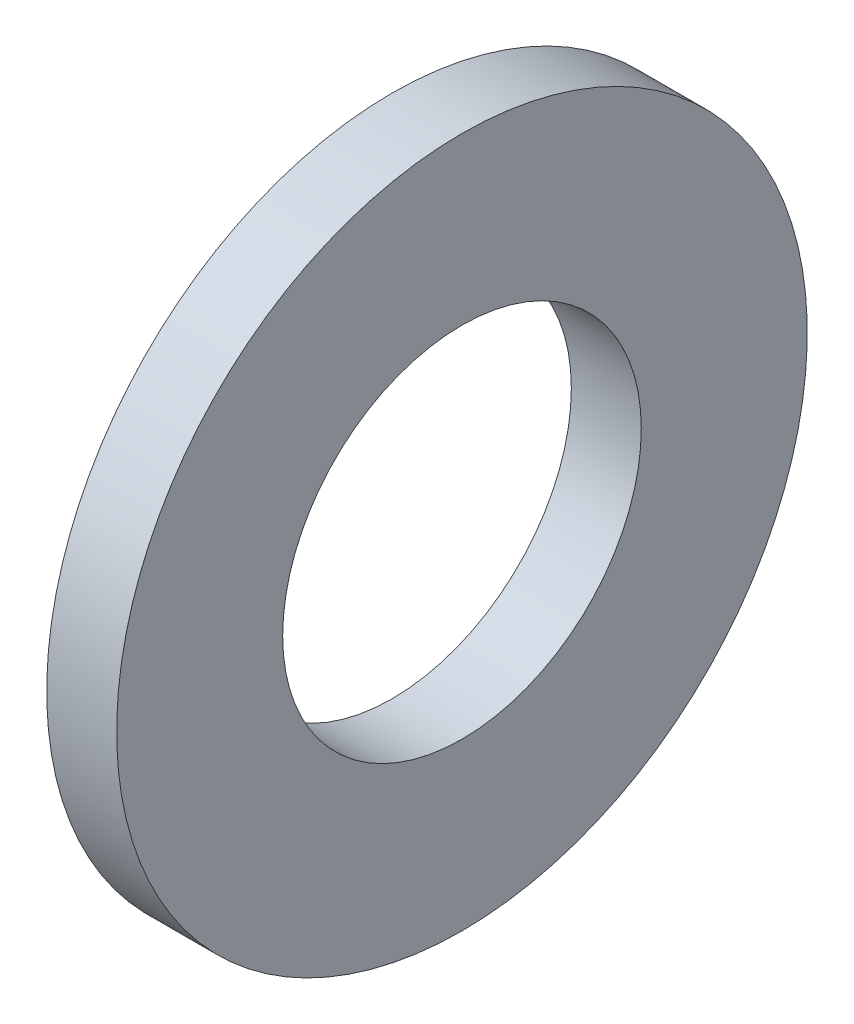
ISO-10303-21;
HEADER;
FILE_DESCRIPTION(('STEP AP214'),'2;1');
FILE_NAME('part.step','',(''),(''),'','','');
FILE_SCHEMA(('AUTOMOTIVE_DESIGN { 1 0 10303 214 1 1 1 1 }'));
ENDSEC;
DATA;
#1=APPLICATION_CONTEXT('core data for automotive mechanical design processes');
#2=APPLICATION_PROTOCOL_DEFINITION('international standard','automotive_design',2000,#1);
#3=PRODUCT_CONTEXT('',#1,'mechanical');
#4=PRODUCT('Part','Part','',(#3));
#5=PRODUCT_RELATED_PRODUCT_CATEGORY('part','',(#4));
#6=PRODUCT_DEFINITION_FORMATION('','',#4);
#7=PRODUCT_DEFINITION_CONTEXT('part definition',#1,'design');
#8=PRODUCT_DEFINITION('design','',#6,#7);
#9=PRODUCT_DEFINITION_SHAPE('','',#8);
#10=(LENGTH_UNIT() NAMED_UNIT(*) SI_UNIT(.MILLI.,.METRE.));
#11=(NAMED_UNIT(*) PLANE_ANGLE_UNIT() SI_UNIT($,.RADIAN.));
#12=(NAMED_UNIT(*) SI_UNIT($,.STERADIAN.) SOLID_ANGLE_UNIT());
#13=UNCERTAINTY_MEASURE_WITH_UNIT(LENGTH_MEASURE(1.E-05),#10,'distance_accuracy_value','');
#14=(GEOMETRIC_REPRESENTATION_CONTEXT(3) GLOBAL_UNCERTAINTY_ASSIGNED_CONTEXT((#13)) GLOBAL_UNIT_ASSIGNED_CONTEXT((#10,
#11,#12)) REPRESENTATION_CONTEXT('',''));
#15=CARTESIAN_POINT('',(0.,0.,0.));
#16=DIRECTION('',(0.,0.,1.));
#17=DIRECTION('',(1.,0.,0.));
#18=AXIS2_PLACEMENT_3D('',#15,#16,#17);
#19=CARTESIAN_POINT('',(-262.807943914232,-420.094616354294,-1427.90544798632));
#20=DIRECTION('',(1.,0.,0.));
#21=DIRECTION('',(0.,1.,0.));
#22=AXIS2_PLACEMENT_3D('',#19,#20,#21);
#23=PLANE('',#22);
#24=CARTESIAN_POINT('',(-262.807943914232,-420.094616354294,-1427.90544798632));
#25=DIRECTION('',(1.,0.,0.));
#26=DIRECTION('',(0.,1.,0.));
#27=AXIS2_PLACEMENT_3D('',#24,#25,#26);
#28=CIRCLE('',#27,5.1435);
#29=CARTESIAN_POINT('',(-262.807943914232,-414.951116354294,-1427.90544798632));
#30=VERTEX_POINT('',#29);
#31=EDGE_CURVE('E27',#30,#30,#28,.T.);
#32=ORIENTED_EDGE('',*,*,#31,.T.);
#33=EDGE_LOOP('',(#32));
#34=FACE_BOUND('',#33,.T.);
#35=CARTESIAN_POINT('',(-262.807943914232,-420.094616354294,-1427.90544798632));
#36=DIRECTION('',(1.,0.,0.));
#37=DIRECTION('',(0.,1.,0.));
#38=AXIS2_PLACEMENT_3D('',#35,#36,#37);
#39=CIRCLE('',#38,9.906);
#40=CARTESIAN_POINT('',(-262.807943914232,-410.188616354294,-1427.90544798632));
#41=VERTEX_POINT('',#40);
#42=EDGE_CURVE('E18',#41,#41,#39,.T.);
#43=ORIENTED_EDGE('',*,*,#42,.F.);
#44=EDGE_LOOP('',(#43));
#45=FACE_BOUND('',#44,.T.);
#46=ADVANCED_FACE('F15',(#34,#45),#23,.F.);
#47=CARTESIAN_POINT('',(-262.807943914232,-420.094616354294,-1427.90544798632));
#48=DIRECTION('',(1.,0.,0.));
#49=DIRECTION('',(0.,1.,0.));
#50=AXIS2_PLACEMENT_3D('',#47,#48,#49);
#51=CYLINDRICAL_SURFACE('',#50,9.906);
#52=CARTESIAN_POINT('',(-260.801343914232,-420.094616354294,-1427.90544798632));
#53=DIRECTION('',(1.,0.,0.));
#54=DIRECTION('',(0.,1.,0.));
#55=AXIS2_PLACEMENT_3D('',#52,#53,#54);
#56=CIRCLE('',#55,9.906);
#57=CARTESIAN_POINT('',(-260.801343914232,-410.188616354294,-1427.90544798632));
#58=VERTEX_POINT('',#57);
#59=EDGE_CURVE('E22',#58,#58,#56,.T.);
#60=ORIENTED_EDGE('',*,*,#59,.F.);
#61=EDGE_LOOP('',(#60));
#62=FACE_BOUND('',#61,.T.);
#63=ORIENTED_EDGE('',*,*,#42,.T.);
#64=EDGE_LOOP('',(#63));
#65=FACE_BOUND('',#64,.T.);
#66=ADVANCED_FACE('F35',(#62,#65),#51,.T.);
#67=CARTESIAN_POINT('',(-262.807943914232,-420.094616354294,-1427.90544798632));
#68=DIRECTION('',(1.,0.,0.));
#69=DIRECTION('',(0.,1.,0.));
#70=AXIS2_PLACEMENT_3D('',#67,#68,#69);
#71=CYLINDRICAL_SURFACE('',#70,5.1435);
#72=CARTESIAN_POINT('',(-260.801343914232,-420.094616354294,-1427.90544798632));
#73=DIRECTION('',(1.,0.,0.));
#74=DIRECTION('',(0.,1.,0.));
#75=AXIS2_PLACEMENT_3D('',#72,#73,#74);
#76=CIRCLE('',#75,5.1435);
#77=CARTESIAN_POINT('',(-260.801343914232,-414.951116354294,-1427.90544798632));
#78=VERTEX_POINT('',#77);
#79=EDGE_CURVE('E10',#78,#78,#76,.F.);
#80=ORIENTED_EDGE('',*,*,#79,.F.);
#81=EDGE_LOOP('',(#80));
#82=FACE_BOUND('',#81,.T.);
#83=ORIENTED_EDGE('',*,*,#31,.F.);
#84=EDGE_LOOP('',(#83));
#85=FACE_BOUND('',#84,.T.);
#86=ADVANCED_FACE('F42',(#82,#85),#71,.F.);
#87=CARTESIAN_POINT('',(-260.801343914232,-420.094616354294,-1427.90544798632));
#88=DIRECTION('',(1.,0.,0.));
#89=DIRECTION('',(0.,1.,0.));
#90=AXIS2_PLACEMENT_3D('',#87,#88,#89);
#91=PLANE('',#90);
#92=ORIENTED_EDGE('',*,*,#79,.T.);
#93=EDGE_LOOP('',(#92));
#94=FACE_BOUND('',#93,.T.);
#95=ORIENTED_EDGE('',*,*,#59,.T.);
#96=EDGE_LOOP('',(#95));
#97=FACE_BOUND('',#96,.T.);
#98=ADVANCED_FACE('F44',(#94,#97),#91,.T.);
#99=CLOSED_SHELL('',(#46,#66,#86,#98));
#100=MANIFOLD_SOLID_BREP('B1',#99);
#101=ADVANCED_BREP_SHAPE_REPRESENTATION('',(#18,#100),#14);
#102=SHAPE_DEFINITION_REPRESENTATION(#9,#101);
ENDSEC;
END-ISO-10303-21;
